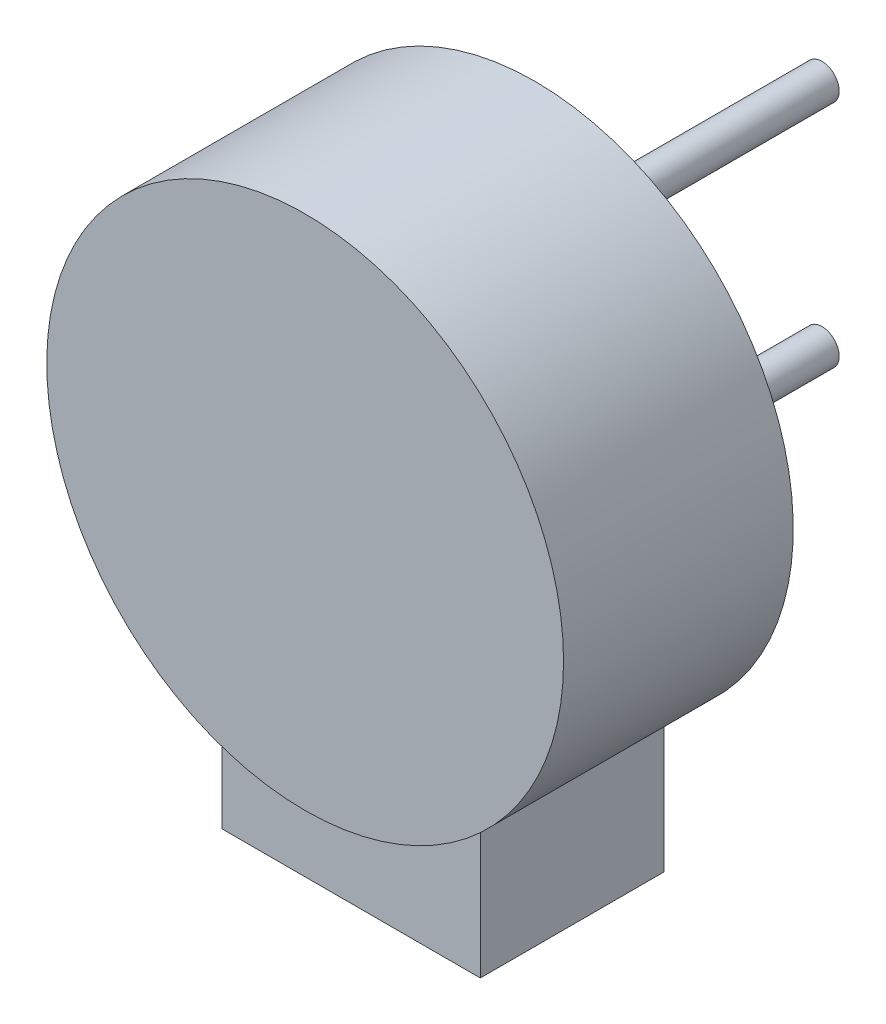
ISO-10303-21;
HEADER;
FILE_DESCRIPTION(('STEP AP214'),'2;1');
FILE_NAME('part.step','',(''),(''),'','','');
FILE_SCHEMA(('AUTOMOTIVE_DESIGN { 1 0 10303 214 1 1 1 1 }'));
ENDSEC;
DATA;
#1=APPLICATION_CONTEXT('core data for automotive mechanical design processes');
#2=APPLICATION_PROTOCOL_DEFINITION('international standard','automotive_design',2000,#1);
#3=PRODUCT_CONTEXT('',#1,'mechanical');
#4=PRODUCT('Part','Part','',(#3));
#5=PRODUCT_RELATED_PRODUCT_CATEGORY('part','',(#4));
#6=PRODUCT_DEFINITION_FORMATION('','',#4);
#7=PRODUCT_DEFINITION_CONTEXT('part definition',#1,'design');
#8=PRODUCT_DEFINITION('design','',#6,#7);
#9=PRODUCT_DEFINITION_SHAPE('','',#8);
#10=(LENGTH_UNIT() NAMED_UNIT(*) SI_UNIT(.MILLI.,.METRE.));
#11=(NAMED_UNIT(*) PLANE_ANGLE_UNIT() SI_UNIT($,.RADIAN.));
#12=(NAMED_UNIT(*) SI_UNIT($,.STERADIAN.) SOLID_ANGLE_UNIT());
#13=UNCERTAINTY_MEASURE_WITH_UNIT(LENGTH_MEASURE(1.E-05),#10,'distance_accuracy_value','');
#14=(GEOMETRIC_REPRESENTATION_CONTEXT(3) GLOBAL_UNCERTAINTY_ASSIGNED_CONTEXT((#13)) GLOBAL_UNIT_ASSIGNED_CONTEXT((#10,
#11,#12)) REPRESENTATION_CONTEXT('',''));
#15=CARTESIAN_POINT('',(0.,0.,0.));
#16=DIRECTION('',(0.,0.,1.));
#17=DIRECTION('',(1.,0.,0.));
#18=AXIS2_PLACEMENT_3D('',#15,#16,#17);
#19=CARTESIAN_POINT('',(45.4,-11.5,5.7));
#20=DIRECTION('',(0.,0.,-1.));
#21=DIRECTION('',(-1.,0.,0.));
#22=AXIS2_PLACEMENT_3D('',#19,#20,#21);
#23=CYLINDRICAL_SURFACE('',#22,4.5);
#24=CARTESIAN_POINT('',(45.40000000001,-11.50000000001,1.70000000001));
#25=DIRECTION('',(0.,0.,-1.));
#26=DIRECTION('',(-1.,0.,0.));
#27=AXIS2_PLACEMENT_3D('',#24,#25,#26);
#28=CIRCLE('',#27,4.50000000001);
#29=CARTESIAN_POINT('',(43.15,-15.39711431703,1.7));
#30=VERTEX_POINT('',#29);
#31=CARTESIAN_POINT('',(47.65,-15.39711431703,1.7));
#32=VERTEX_POINT('',#31);
#33=EDGE_CURVE('E102',#30,#32,#28,.T.);
#34=ORIENTED_EDGE('',*,*,#33,.F.);
#35=DIRECTION('',(0.,0.,1.));
#36=VECTOR('',#35,1.);
#37=CARTESIAN_POINT('',(43.15000000001,-15.39711431704,1.70000000001));
#38=LINE('',#37,#36);
#39=CARTESIAN_POINT('',(43.15,-15.39711431703,4.9));
#40=VERTEX_POINT('',#39);
#41=EDGE_CURVE('E103',#30,#40,#38,.T.);
#42=ORIENTED_EDGE('',*,*,#41,.T.);
#43=CARTESIAN_POINT('',(45.40000000001,-11.50000000001,4.90000000001));
#44=DIRECTION('',(0.,0.,-1.));
#45=DIRECTION('',(0.500000000000721,-0.866025403784022,0.));
#46=AXIS2_PLACEMENT_3D('',#43,#44,#45);
#47=CIRCLE('',#46,4.50000000001366);
#48=CARTESIAN_POINT('',(47.65,-15.39711431703,4.9));
#49=VERTEX_POINT('',#48);
#50=EDGE_CURVE('E90',#49,#40,#47,.T.);
#51=ORIENTED_EDGE('',*,*,#50,.F.);
#52=DIRECTION('',(0.,0.,-1.));
#53=VECTOR('',#52,1.);
#54=CARTESIAN_POINT('',(47.65000000001,-15.39711431704,4.90000000001));
#55=LINE('',#54,#53);
#56=EDGE_CURVE('E21',#49,#32,#55,.T.);
#57=ORIENTED_EDGE('',*,*,#56,.T.);
#58=EDGE_LOOP('',(#34,#42,#51,#57));
#59=FACE_BOUND('',#58,.T.);
#60=CARTESIAN_POINT('',(45.40000000001,-11.50000000001,5.70000000001));
#61=DIRECTION('',(0.,0.,1.));
#62=DIRECTION('',(1.,0.,0.));
#63=AXIS2_PLACEMENT_3D('',#60,#61,#62);
#64=CIRCLE('',#63,4.50000000001);
#65=CARTESIAN_POINT('',(49.90000000002,-11.50000000001,5.70000000001));
#66=VERTEX_POINT('',#65);
#67=EDGE_CURVE('E76',#66,#66,#64,.T.);
#68=ORIENTED_EDGE('',*,*,#67,.F.);
#69=EDGE_LOOP('',(#68));
#70=FACE_BOUND('',#69,.T.);
#71=ADVANCED_FACE('F17',(#59,#70),#23,.T.);
#72=CARTESIAN_POINT('',(45.4,-11.5,1.7));
#73=DIRECTION('',(0.,0.,1.));
#74=DIRECTION('',(1.,0.,0.));
#75=AXIS2_PLACEMENT_3D('',#72,#73,#74);
#76=PLANE('',#75);
#77=DIRECTION('',(0.,-1.,0.));
#78=VECTOR('',#77,1.);
#79=CARTESIAN_POINT('',(47.65000000001,-15.39711431704,1.70000000001));
#80=LINE('',#79,#78);
#81=CARTESIAN_POINT('',(47.65,-17.8,1.7));
#82=VERTEX_POINT('',#81);
#83=EDGE_CURVE('E11',#32,#82,#80,.T.);
#84=ORIENTED_EDGE('',*,*,#83,.T.);
#85=DIRECTION('',(1.,0.,0.));
#86=VECTOR('',#85,1.);
#87=CARTESIAN_POINT('',(43.15000000001,-17.80000000001,1.70000000001));
#88=LINE('',#87,#86);
#89=CARTESIAN_POINT('',(43.15,-17.8,1.7));
#90=VERTEX_POINT('',#89);
#91=EDGE_CURVE('E40',#90,#82,#88,.T.);
#92=ORIENTED_EDGE('',*,*,#91,.F.);
#93=DIRECTION('',(0.,1.,0.));
#94=VECTOR('',#93,1.);
#95=CARTESIAN_POINT('',(43.15000000001,-17.80000000001,1.70000000001));
#96=LINE('',#95,#94);
#97=EDGE_CURVE('E28',#90,#30,#96,.T.);
#98=ORIENTED_EDGE('',*,*,#97,.T.);
#99=ORIENTED_EDGE('',*,*,#33,.T.);
#100=EDGE_LOOP('',(#84,#92,#98,#99));
#101=FACE_BOUND('',#100,.T.);
#102=CARTESIAN_POINT('',(45.40000000001,-13.50000000001,1.70000000001));
#103=DIRECTION('',(0.,0.,1.));
#104=DIRECTION('',(-1.,0.,0.));
#105=AXIS2_PLACEMENT_3D('',#102,#103,#104);
#106=CIRCLE('',#105,0.30000000001);
#107=CARTESIAN_POINT('',(45.1,-13.50000000001,1.70000000001));
#108=VERTEX_POINT('',#107);
#109=EDGE_CURVE('E116',#108,#108,#106,.T.);
#110=ORIENTED_EDGE('',*,*,#109,.T.);
#111=EDGE_LOOP('',(#110));
#112=FACE_BOUND('',#111,.T.);
#113=CARTESIAN_POINT('',(45.40000000001,-9.50000000001,1.70000000001));
#114=DIRECTION('',(0.,0.,1.));
#115=DIRECTION('',(1.,0.,0.));
#116=AXIS2_PLACEMENT_3D('',#113,#114,#115);
#117=CIRCLE('',#116,0.30000000001);
#118=CARTESIAN_POINT('',(45.70000000002,-9.50000000001,1.70000000001));
#119=VERTEX_POINT('',#118);
#120=EDGE_CURVE('E109',#119,#119,#117,.T.);
#121=ORIENTED_EDGE('',*,*,#120,.T.);
#122=EDGE_LOOP('',(#121));
#123=FACE_BOUND('',#122,.T.);
#124=ADVANCED_FACE('F139',(#101,#112,#123),#76,.F.);
#125=CARTESIAN_POINT('',(45.4,-9.5,-3.3));
#126=DIRECTION('',(0.,0.,1.));
#127=DIRECTION('',(1.,0.,0.));
#128=AXIS2_PLACEMENT_3D('',#125,#126,#127);
#129=CYLINDRICAL_SURFACE('',#128,0.3);
#130=ORIENTED_EDGE('',*,*,#120,.F.);
#131=EDGE_LOOP('',(#130));
#132=FACE_BOUND('',#131,.T.);
#133=CARTESIAN_POINT('',(45.40000000001,-9.50000000001,-3.30000000001));
#134=DIRECTION('',(0.,0.,-1.));
#135=DIRECTION('',(0.,-1.,0.));
#136=AXIS2_PLACEMENT_3D('',#133,#134,#135);
#137=CIRCLE('',#136,0.30000000001);
#138=CARTESIAN_POINT('',(45.40000000001,-9.80000000002,-3.30000000001));
#139=VERTEX_POINT('',#138);
#140=EDGE_CURVE('E106',#139,#139,#137,.T.);
#141=ORIENTED_EDGE('',*,*,#140,.F.);
#142=EDGE_LOOP('',(#141));
#143=FACE_BOUND('',#142,.T.);
#144=ADVANCED_FACE('F135',(#132,#143),#129,.T.);
#145=CARTESIAN_POINT('',(45.4,-9.5,-3.3));
#146=DIRECTION('',(0.,0.,-1.));
#147=DIRECTION('',(0.,-1.,0.));
#148=AXIS2_PLACEMENT_3D('',#145,#146,#147);
#149=PLANE('',#148);
#150=ORIENTED_EDGE('',*,*,#140,.T.);
#151=EDGE_LOOP('',(#150));
#152=FACE_BOUND('',#151,.T.);
#153=ADVANCED_FACE('F19',(#152),#149,.T.);
#154=CARTESIAN_POINT('',(45.4,-13.5,-3.3));
#155=DIRECTION('',(0.,0.,1.));
#156=DIRECTION('',(1.,0.,0.));
#157=AXIS2_PLACEMENT_3D('',#154,#155,#156);
#158=CYLINDRICAL_SURFACE('',#157,0.3);
#159=ORIENTED_EDGE('',*,*,#109,.F.);
#160=EDGE_LOOP('',(#159));
#161=FACE_BOUND('',#160,.T.);
#162=CARTESIAN_POINT('',(45.40000000001,-13.50000000001,-3.30000000001));
#163=DIRECTION('',(0.,0.,-1.));
#164=DIRECTION('',(0.,1.,0.));
#165=AXIS2_PLACEMENT_3D('',#162,#163,#164);
#166=CIRCLE('',#165,0.30000000001);
#167=CARTESIAN_POINT('',(45.40000000001,-13.2,-3.30000000001));
#168=VERTEX_POINT('',#167);
#169=EDGE_CURVE('E94',#168,#168,#166,.T.);
#170=ORIENTED_EDGE('',*,*,#169,.F.);
#171=EDGE_LOOP('',(#170));
#172=FACE_BOUND('',#171,.T.);
#173=ADVANCED_FACE('F124',(#161,#172),#158,.T.);
#174=CARTESIAN_POINT('',(45.4,-13.5,-3.3));
#175=DIRECTION('',(0.,0.,-1.));
#176=DIRECTION('',(0.,-1.,0.));
#177=AXIS2_PLACEMENT_3D('',#174,#175,#176);
#178=PLANE('',#177);
#179=ORIENTED_EDGE('',*,*,#169,.T.);
#180=EDGE_LOOP('',(#179));
#181=FACE_BOUND('',#180,.T.);
#182=ADVANCED_FACE('F122',(#181),#178,.T.);
#183=CARTESIAN_POINT('',(47.65,-13.3,4.9));
#184=DIRECTION('',(1.,0.,0.));
#185=DIRECTION('',(0.,1.,0.));
#186=AXIS2_PLACEMENT_3D('',#183,#184,#185);
#187=PLANE('',#186);
#188=DIRECTION('',(0.,1.,0.));
#189=VECTOR('',#188,1.);
#190=CARTESIAN_POINT('',(47.65000000001,-17.80000000001,4.90000000001));
#191=LINE('',#190,#189);
#192=CARTESIAN_POINT('',(47.65,-17.8,4.9));
#193=VERTEX_POINT('',#192);
#194=EDGE_CURVE('E67',#193,#49,#191,.T.);
#195=ORIENTED_EDGE('',*,*,#194,.F.);
#196=DIRECTION('',(0.,0.,1.));
#197=VECTOR('',#196,1.);
#198=CARTESIAN_POINT('',(47.65000000001,-17.80000000001,1.70000000001));
#199=LINE('',#198,#197);
#200=EDGE_CURVE('E70',#82,#193,#199,.T.);
#201=ORIENTED_EDGE('',*,*,#200,.F.);
#202=ORIENTED_EDGE('',*,*,#83,.F.);
#203=ORIENTED_EDGE('',*,*,#56,.F.);
#204=EDGE_LOOP('',(#195,#201,#202,#203));
#205=FACE_BOUND('',#204,.T.);
#206=ADVANCED_FACE('F68',(#205),#187,.T.);
#207=CARTESIAN_POINT('',(47.65,-17.8,4.9));
#208=DIRECTION('',(0.,-1.,0.));
#209=DIRECTION('',(0.,0.,-1.));
#210=AXIS2_PLACEMENT_3D('',#207,#208,#209);
#211=PLANE('',#210);
#212=ORIENTED_EDGE('',*,*,#200,.T.);
#213=DIRECTION('',(1.,0.,0.));
#214=VECTOR('',#213,1.);
#215=CARTESIAN_POINT('',(43.15000000001,-17.80000000001,4.90000000001));
#216=LINE('',#215,#214);
#217=CARTESIAN_POINT('',(43.15,-17.8,4.9));
#218=VERTEX_POINT('',#217);
#219=EDGE_CURVE('E75',#218,#193,#216,.T.);
#220=ORIENTED_EDGE('',*,*,#219,.F.);
#221=DIRECTION('',(0.,0.,1.));
#222=VECTOR('',#221,1.);
#223=CARTESIAN_POINT('',(43.15000000001,-17.80000000001,1.70000000001));
#224=LINE('',#223,#222);
#225=EDGE_CURVE('E98',#90,#218,#224,.T.);
#226=ORIENTED_EDGE('',*,*,#225,.F.);
#227=ORIENTED_EDGE('',*,*,#91,.T.);
#228=EDGE_LOOP('',(#212,#220,#226,#227));
#229=FACE_BOUND('',#228,.T.);
#230=ADVANCED_FACE('F78',(#229),#211,.T.);
#231=CARTESIAN_POINT('',(43.15,-17.8,4.9));
#232=DIRECTION('',(-1.,0.,0.));
#233=DIRECTION('',(0.,0.,1.));
#234=AXIS2_PLACEMENT_3D('',#231,#232,#233);
#235=PLANE('',#234);
#236=ORIENTED_EDGE('',*,*,#97,.F.);
#237=ORIENTED_EDGE('',*,*,#225,.T.);
#238=DIRECTION('',(0.,-1.,0.));
#239=VECTOR('',#238,1.);
#240=CARTESIAN_POINT('',(43.15000000001,-15.39711431704,4.90000000001));
#241=LINE('',#240,#239);
#242=EDGE_CURVE('E85',#40,#218,#241,.T.);
#243=ORIENTED_EDGE('',*,*,#242,.F.);
#244=ORIENTED_EDGE('',*,*,#41,.F.);
#245=EDGE_LOOP('',(#236,#237,#243,#244));
#246=FACE_BOUND('',#245,.T.);
#247=ADVANCED_FACE('F152',(#246),#235,.T.);
#248=CARTESIAN_POINT('',(45.4,-11.5,4.9));
#249=DIRECTION('',(0.,0.,-1.));
#250=DIRECTION('',(0.,-1.,0.));
#251=AXIS2_PLACEMENT_3D('',#248,#249,#250);
#252=PLANE('',#251);
#253=ORIENTED_EDGE('',*,*,#50,.T.);
#254=ORIENTED_EDGE('',*,*,#242,.T.);
#255=ORIENTED_EDGE('',*,*,#219,.T.);
#256=ORIENTED_EDGE('',*,*,#194,.T.);
#257=EDGE_LOOP('',(#253,#254,#255,#256));
#258=FACE_BOUND('',#257,.T.);
#259=ADVANCED_FACE('F83',(#258),#252,.F.);
#260=CARTESIAN_POINT('',(45.4,-11.5,5.7));
#261=DIRECTION('',(0.,0.,1.));
#262=DIRECTION('',(1.,0.,0.));
#263=AXIS2_PLACEMENT_3D('',#260,#261,#262);
#264=PLANE('',#263);
#265=ORIENTED_EDGE('',*,*,#67,.T.);
#266=EDGE_LOOP('',(#265));
#267=FACE_BOUND('',#266,.T.);
#268=ADVANCED_FACE('F151',(#267),#264,.T.);
#269=CLOSED_SHELL('',(#71,#124,#144,#153,#173,#182,#206,#230,#247,#259,#268));
#270=MANIFOLD_SOLID_BREP('B1',#269);
#271=ADVANCED_BREP_SHAPE_REPRESENTATION('',(#18,#270),#14);
#272=SHAPE_DEFINITION_REPRESENTATION(#9,#271);
ENDSEC;
END-ISO-10303-21;
